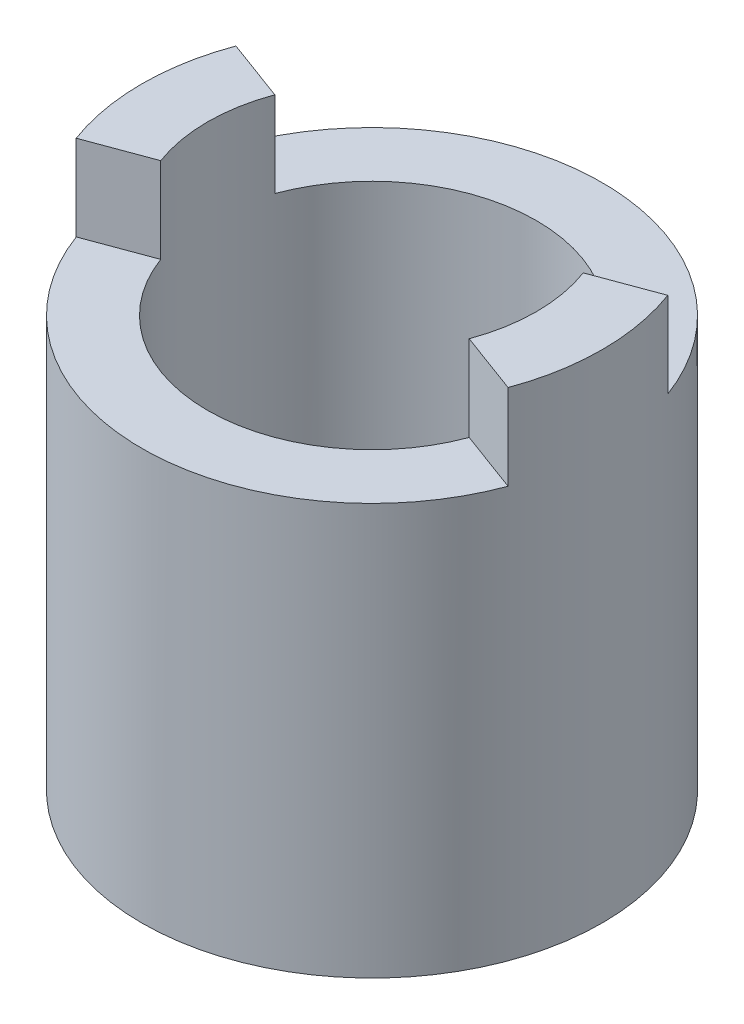
ISO-10303-21;
HEADER;
FILE_DESCRIPTION(('STEP AP214'),'2;1');
FILE_NAME('part.step','',(''),(''),'','','');
FILE_SCHEMA(('AUTOMOTIVE_DESIGN { 1 0 10303 214 1 1 1 1 }'));
ENDSEC;
DATA;
#1=APPLICATION_CONTEXT('core data for automotive mechanical design processes');
#2=APPLICATION_PROTOCOL_DEFINITION('international standard','automotive_design',2000,#1);
#3=PRODUCT_CONTEXT('',#1,'mechanical');
#4=PRODUCT('Part','Part','',(#3));
#5=PRODUCT_RELATED_PRODUCT_CATEGORY('part','',(#4));
#6=PRODUCT_DEFINITION_FORMATION('','',#4);
#7=PRODUCT_DEFINITION_CONTEXT('part definition',#1,'design');
#8=PRODUCT_DEFINITION('design','',#6,#7);
#9=PRODUCT_DEFINITION_SHAPE('','',#8);
#10=(LENGTH_UNIT() NAMED_UNIT(*) SI_UNIT(.MILLI.,.METRE.));
#11=(NAMED_UNIT(*) PLANE_ANGLE_UNIT() SI_UNIT($,.RADIAN.));
#12=(NAMED_UNIT(*) SI_UNIT($,.STERADIAN.) SOLID_ANGLE_UNIT());
#13=UNCERTAINTY_MEASURE_WITH_UNIT(LENGTH_MEASURE(1.E-05),#10,'distance_accuracy_value','');
#14=(GEOMETRIC_REPRESENTATION_CONTEXT(3) GLOBAL_UNCERTAINTY_ASSIGNED_CONTEXT((#13)) GLOBAL_UNIT_ASSIGNED_CONTEXT((#10,
#11,#12)) REPRESENTATION_CONTEXT('',''));
#15=CARTESIAN_POINT('',(0.,0.,0.));
#16=DIRECTION('',(0.,0.,1.));
#17=DIRECTION('',(1.,0.,0.));
#18=AXIS2_PLACEMENT_3D('',#15,#16,#17);
#19=CARTESIAN_POINT('',(0.,6.25,0.));
#20=DIRECTION('',(0.,1.,0.));
#21=DIRECTION('',(0.,0.,1.));
#22=AXIS2_PLACEMENT_3D('',#19,#20,#21);
#23=PLANE('',#22);
#24=CARTESIAN_POINT('',(0.,6.25,0.));
#25=DIRECTION('',(0.,1.,0.));
#26=DIRECTION('',(0.,0.,1.));
#27=AXIS2_PLACEMENT_3D('',#24,#25,#26);
#28=CIRCLE('',#27,2.5);
#29=CARTESIAN_POINT('',(-2.34475912302273,6.25,0.867239675638555));
#30=VERTEX_POINT('',#29);
#31=CARTESIAN_POINT('',(2.34475912302273,6.25,0.867239675638555));
#32=VERTEX_POINT('',#31);
#33=EDGE_CURVE('E61',#30,#32,#28,.T.);
#34=ORIENTED_EDGE('',*,*,#33,.F.);
#35=DIRECTION('',(0.937903649209093,0.,-0.346895870255422));
#36=VECTOR('',#35,1.);
#37=CARTESIAN_POINT('',(-2.34475912302273,6.25,0.867239675638555));
#38=LINE('',#37,#36);
#39=CARTESIAN_POINT('',(-3.28266277223183,6.25,1.21413554589398));
#40=VERTEX_POINT('',#39);
#41=EDGE_CURVE('E187',#40,#30,#38,.T.);
#42=ORIENTED_EDGE('',*,*,#41,.F.);
#43=CARTESIAN_POINT('',(0.,6.25,0.));
#44=DIRECTION('',(0.,1.,0.));
#45=DIRECTION('',(0.,0.,1.));
#46=AXIS2_PLACEMENT_3D('',#43,#44,#45);
#47=CIRCLE('',#46,3.5);
#48=CARTESIAN_POINT('',(3.28266277223183,6.25,1.21413554589398));
#49=VERTEX_POINT('',#48);
#50=EDGE_CURVE('E49',#40,#49,#47,.T.);
#51=ORIENTED_EDGE('',*,*,#50,.T.);
#52=DIRECTION('',(0.937903649209093,0.,0.346895870255422));
#53=VECTOR('',#52,1.);
#54=CARTESIAN_POINT('',(2.34475912302273,6.25,0.867239675638555));
#55=LINE('',#54,#53);
#56=EDGE_CURVE('E136',#32,#49,#55,.T.);
#57=ORIENTED_EDGE('',*,*,#56,.F.);
#58=EDGE_LOOP('',(#34,#42,#51,#57));
#59=FACE_BOUND('',#58,.T.);
#60=ADVANCED_FACE('F39',(#59),#23,.T.);
#61=CARTESIAN_POINT('',(3.28266277223183,6.25,-1.21413554589398));
#62=VERTEX_POINT('',#61);
#63=CARTESIAN_POINT('',(-3.28266277223183,6.25,-1.21413554589398));
#64=VERTEX_POINT('',#63);
#65=EDGE_CURVE('E11',#62,#64,#47,.T.);
#66=ORIENTED_EDGE('',*,*,#65,.T.);
#67=DIRECTION('',(-0.937903649209093,0.,-0.346895870255422));
#68=VECTOR('',#67,1.);
#69=CARTESIAN_POINT('',(-2.34475912302273,6.25,-0.867239675638555));
#70=LINE('',#69,#68);
#71=CARTESIAN_POINT('',(-2.34475912302273,6.25,-0.867239675638555));
#72=VERTEX_POINT('',#71);
#73=EDGE_CURVE('E124',#72,#64,#70,.T.);
#74=ORIENTED_EDGE('',*,*,#73,.F.);
#75=CARTESIAN_POINT('',(2.34475912302273,6.25,-0.867239675638555));
#76=VERTEX_POINT('',#75);
#77=EDGE_CURVE('E174',#76,#72,#28,.T.);
#78=ORIENTED_EDGE('',*,*,#77,.F.);
#79=DIRECTION('',(-0.937903649209093,0.,0.346895870255422));
#80=VECTOR('',#79,1.);
#81=CARTESIAN_POINT('',(2.34475912302273,6.25,-0.867239675638555));
#82=LINE('',#81,#80);
#83=EDGE_CURVE('E131',#62,#76,#82,.T.);
#84=ORIENTED_EDGE('',*,*,#83,.F.);
#85=EDGE_LOOP('',(#66,#74,#78,#84));
#86=FACE_BOUND('',#85,.T.);
#87=ADVANCED_FACE('F213',(#86),#23,.T.);
#88=CARTESIAN_POINT('',(0.,0.,0.));
#89=DIRECTION('',(0.,1.,0.));
#90=DIRECTION('',(0.,0.,1.));
#91=AXIS2_PLACEMENT_3D('',#88,#89,#90);
#92=PLANE('',#91);
#93=CARTESIAN_POINT('',(0.,0.,0.));
#94=DIRECTION('',(0.,1.,0.));
#95=DIRECTION('',(0.,0.,1.));
#96=AXIS2_PLACEMENT_3D('',#93,#94,#95);
#97=CIRCLE('',#96,3.5);
#98=CARTESIAN_POINT('',(0.,0.,3.5));
#99=VERTEX_POINT('',#98);
#100=EDGE_CURVE('E43',#99,#99,#97,.T.);
#101=ORIENTED_EDGE('',*,*,#100,.F.);
#102=EDGE_LOOP('',(#101));
#103=FACE_BOUND('',#102,.T.);
#104=CARTESIAN_POINT('',(0.,0.,0.));
#105=DIRECTION('',(0.,1.,0.));
#106=DIRECTION('',(0.,0.,1.));
#107=AXIS2_PLACEMENT_3D('',#104,#105,#106);
#108=CIRCLE('',#107,2.5);
#109=CARTESIAN_POINT('',(0.,0.,2.5));
#110=VERTEX_POINT('',#109);
#111=EDGE_CURVE('E173',#110,#110,#108,.T.);
#112=ORIENTED_EDGE('',*,*,#111,.T.);
#113=EDGE_LOOP('',(#112));
#114=FACE_BOUND('',#113,.T.);
#115=ADVANCED_FACE('F210',(#103,#114),#92,.F.);
#116=CARTESIAN_POINT('',(0.,6.25,0.));
#117=DIRECTION('',(0.,-1.,0.));
#118=DIRECTION('',(0.,0.,-1.));
#119=AXIS2_PLACEMENT_3D('',#116,#117,#118);
#120=CYLINDRICAL_SURFACE('',#119,3.5);
#121=ORIENTED_EDGE('',*,*,#65,.F.);
#122=DIRECTION('',(0.,-1.,0.));
#123=VECTOR('',#122,1.);
#124=CARTESIAN_POINT('',(3.28266277223183,7.55,-1.21413554589398));
#125=LINE('',#124,#123);
#126=CARTESIAN_POINT('',(3.28266277223183,7.55,-1.21413554589398));
#127=VERTEX_POINT('',#126);
#128=EDGE_CURVE('E169',#127,#62,#125,.T.);
#129=ORIENTED_EDGE('',*,*,#128,.F.);
#130=CARTESIAN_POINT('',(0.,7.55,0.));
#131=DIRECTION('',(0.,1.,0.));
#132=DIRECTION('',(0.,0.,1.));
#133=AXIS2_PLACEMENT_3D('',#130,#131,#132);
#134=CIRCLE('',#133,3.5);
#135=CARTESIAN_POINT('',(3.28266277223183,7.55,1.21413554589398));
#136=VERTEX_POINT('',#135);
#137=EDGE_CURVE('E142',#136,#127,#134,.T.);
#138=ORIENTED_EDGE('',*,*,#137,.F.);
#139=DIRECTION('',(0.,-1.,0.));
#140=VECTOR('',#139,1.);
#141=CARTESIAN_POINT('',(3.28266277223183,7.55,1.21413554589398));
#142=LINE('',#141,#140);
#143=EDGE_CURVE('E154',#136,#49,#142,.T.);
#144=ORIENTED_EDGE('',*,*,#143,.T.);
#145=ORIENTED_EDGE('',*,*,#50,.F.);
#146=DIRECTION('',(0.,-1.,0.));
#147=VECTOR('',#146,1.);
#148=CARTESIAN_POINT('',(-3.28266277223183,7.55,1.21413554589398));
#149=LINE('',#148,#147);
#150=CARTESIAN_POINT('',(-3.28266277223183,7.55,1.21413554589398));
#151=VERTEX_POINT('',#150);
#152=EDGE_CURVE('E109',#151,#40,#149,.T.);
#153=ORIENTED_EDGE('',*,*,#152,.F.);
#154=CARTESIAN_POINT('',(0.,7.55,0.));
#155=DIRECTION('',(0.,1.,0.));
#156=DIRECTION('',(0.,0.,1.));
#157=AXIS2_PLACEMENT_3D('',#154,#155,#156);
#158=CIRCLE('',#157,3.5);
#159=CARTESIAN_POINT('',(-3.28266277223183,7.55,-1.21413554589398));
#160=VERTEX_POINT('',#159);
#161=EDGE_CURVE('E114',#160,#151,#158,.T.);
#162=ORIENTED_EDGE('',*,*,#161,.F.);
#163=DIRECTION('',(0.,-1.,0.));
#164=VECTOR('',#163,1.);
#165=CARTESIAN_POINT('',(-3.28266277223183,7.55,-1.21413554589398));
#166=LINE('',#165,#164);
#167=EDGE_CURVE('E290',#160,#64,#166,.T.);
#168=ORIENTED_EDGE('',*,*,#167,.T.);
#169=EDGE_LOOP('',(#121,#129,#138,#144,#145,#153,#162,#168));
#170=FACE_BOUND('',#169,.T.);
#171=ORIENTED_EDGE('',*,*,#100,.T.);
#172=EDGE_LOOP('',(#171));
#173=FACE_BOUND('',#172,.T.);
#174=ADVANCED_FACE('F41',(#170,#173),#120,.T.);
#175=CARTESIAN_POINT('',(0.,6.25,0.));
#176=DIRECTION('',(0.,-1.,0.));
#177=DIRECTION('',(0.,0.,-1.));
#178=AXIS2_PLACEMENT_3D('',#175,#176,#177);
#179=CYLINDRICAL_SURFACE('',#178,2.5);
#180=ORIENTED_EDGE('',*,*,#77,.T.);
#181=DIRECTION('',(0.,-1.,0.));
#182=VECTOR('',#181,1.);
#183=CARTESIAN_POINT('',(-2.34475912302273,7.55,-0.867239675638555));
#184=LINE('',#183,#182);
#185=CARTESIAN_POINT('',(-2.34475912302273,7.55,-0.867239675638555));
#186=VERTEX_POINT('',#185);
#187=EDGE_CURVE('E138',#186,#72,#184,.T.);
#188=ORIENTED_EDGE('',*,*,#187,.F.);
#189=CARTESIAN_POINT('',(0.,7.55,0.));
#190=DIRECTION('',(0.,-1.,0.));
#191=DIRECTION('',(0.,0.,1.));
#192=AXIS2_PLACEMENT_3D('',#189,#190,#191);
#193=CIRCLE('',#192,2.5);
#194=CARTESIAN_POINT('',(-2.34475912302273,7.55,0.867239675638555));
#195=VERTEX_POINT('',#194);
#196=EDGE_CURVE('E113',#195,#186,#193,.T.);
#197=ORIENTED_EDGE('',*,*,#196,.F.);
#198=DIRECTION('',(0.,-1.,0.));
#199=VECTOR('',#198,1.);
#200=CARTESIAN_POINT('',(-2.34475912302273,7.55,0.867239675638555));
#201=LINE('',#200,#199);
#202=EDGE_CURVE('E56',#195,#30,#201,.T.);
#203=ORIENTED_EDGE('',*,*,#202,.T.);
#204=ORIENTED_EDGE('',*,*,#33,.T.);
#205=DIRECTION('',(0.,-1.,0.));
#206=VECTOR('',#205,1.);
#207=CARTESIAN_POINT('',(2.34475912302273,7.55,0.867239675638555));
#208=LINE('',#207,#206);
#209=CARTESIAN_POINT('',(2.34475912302273,7.55,0.867239675638555));
#210=VERTEX_POINT('',#209);
#211=EDGE_CURVE('E161',#210,#32,#208,.T.);
#212=ORIENTED_EDGE('',*,*,#211,.F.);
#213=CARTESIAN_POINT('',(0.,7.55,0.));
#214=DIRECTION('',(0.,-1.,0.));
#215=DIRECTION('',(0.,0.,1.));
#216=AXIS2_PLACEMENT_3D('',#213,#214,#215);
#217=CIRCLE('',#216,2.5);
#218=CARTESIAN_POINT('',(2.34475912302273,7.55,-0.867239675638555));
#219=VERTEX_POINT('',#218);
#220=EDGE_CURVE('E149',#219,#210,#217,.T.);
#221=ORIENTED_EDGE('',*,*,#220,.F.);
#222=DIRECTION('',(0.,-1.,0.));
#223=VECTOR('',#222,1.);
#224=CARTESIAN_POINT('',(2.34475912302273,7.55,-0.867239675638555));
#225=LINE('',#224,#223);
#226=EDGE_CURVE('E165',#219,#76,#225,.T.);
#227=ORIENTED_EDGE('',*,*,#226,.T.);
#228=EDGE_LOOP('',(#180,#188,#197,#203,#204,#212,#221,#227));
#229=FACE_BOUND('',#228,.T.);
#230=ORIENTED_EDGE('',*,*,#111,.F.);
#231=EDGE_LOOP('',(#230));
#232=FACE_BOUND('',#231,.T.);
#233=ADVANCED_FACE('F198',(#229,#232),#179,.F.);
#234=CARTESIAN_POINT('',(2.34475912302273,7.55,-0.867239675638555));
#235=DIRECTION('',(0.346895870255422,0.,0.937903649209093));
#236=DIRECTION('',(0.937903649209093,0.,-0.346895870255422));
#237=AXIS2_PLACEMENT_3D('',#234,#235,#236);
#238=PLANE('',#237);
#239=ORIENTED_EDGE('',*,*,#83,.T.);
#240=ORIENTED_EDGE('',*,*,#226,.F.);
#241=DIRECTION('',(-0.937903649209093,0.,0.346895870255422));
#242=VECTOR('',#241,1.);
#243=CARTESIAN_POINT('',(2.34475912302273,7.55,-0.867239675638555));
#244=LINE('',#243,#242);
#245=EDGE_CURVE('E146',#127,#219,#244,.T.);
#246=ORIENTED_EDGE('',*,*,#245,.F.);
#247=ORIENTED_EDGE('',*,*,#128,.T.);
#248=EDGE_LOOP('',(#239,#240,#246,#247));
#249=FACE_BOUND('',#248,.T.);
#250=ADVANCED_FACE('F202',(#249),#238,.F.);
#251=CARTESIAN_POINT('',(2.34475912302273,7.55,0.867239675638555));
#252=DIRECTION('',(0.346895870255422,0.,-0.937903649209093));
#253=DIRECTION('',(-0.937903649209093,0.,-0.346895870255422));
#254=AXIS2_PLACEMENT_3D('',#251,#252,#253);
#255=PLANE('',#254);
#256=ORIENTED_EDGE('',*,*,#56,.T.);
#257=ORIENTED_EDGE('',*,*,#143,.F.);
#258=DIRECTION('',(0.937903649209093,0.,0.346895870255422));
#259=VECTOR('',#258,1.);
#260=CARTESIAN_POINT('',(2.34475912302273,7.55,0.867239675638555));
#261=LINE('',#260,#259);
#262=EDGE_CURVE('E152',#210,#136,#261,.T.);
#263=ORIENTED_EDGE('',*,*,#262,.F.);
#264=ORIENTED_EDGE('',*,*,#211,.T.);
#265=EDGE_LOOP('',(#256,#257,#263,#264));
#266=FACE_BOUND('',#265,.T.);
#267=ADVANCED_FACE('F190',(#266),#255,.F.);
#268=CARTESIAN_POINT('',(0.,7.55,0.));
#269=DIRECTION('',(0.,1.,0.));
#270=DIRECTION('',(0.,0.,1.));
#271=AXIS2_PLACEMENT_3D('',#268,#269,#270);
#272=PLANE('',#271);
#273=ORIENTED_EDGE('',*,*,#137,.T.);
#274=ORIENTED_EDGE('',*,*,#245,.T.);
#275=ORIENTED_EDGE('',*,*,#220,.T.);
#276=ORIENTED_EDGE('',*,*,#262,.T.);
#277=EDGE_LOOP('',(#273,#274,#275,#276));
#278=FACE_BOUND('',#277,.T.);
#279=ADVANCED_FACE('F195',(#278),#272,.T.);
#280=CARTESIAN_POINT('',(-2.34475912302273,7.55,0.867239675638555));
#281=DIRECTION('',(-0.346895870255422,0.,-0.937903649209093));
#282=DIRECTION('',(-0.937903649209093,0.,0.346895870255422));
#283=AXIS2_PLACEMENT_3D('',#280,#281,#282);
#284=PLANE('',#283);
#285=ORIENTED_EDGE('',*,*,#41,.T.);
#286=ORIENTED_EDGE('',*,*,#202,.F.);
#287=DIRECTION('',(0.937903649209093,0.,-0.346895870255422));
#288=VECTOR('',#287,1.);
#289=CARTESIAN_POINT('',(-2.34475912302273,7.55,0.867239675638555));
#290=LINE('',#289,#288);
#291=EDGE_CURVE('E105',#151,#195,#290,.T.);
#292=ORIENTED_EDGE('',*,*,#291,.F.);
#293=ORIENTED_EDGE('',*,*,#152,.T.);
#294=EDGE_LOOP('',(#285,#286,#292,#293));
#295=FACE_BOUND('',#294,.T.);
#296=ADVANCED_FACE('F107',(#295),#284,.F.);
#297=CARTESIAN_POINT('',(-2.34475912302273,7.55,-0.867239675638555));
#298=DIRECTION('',(-0.346895870255422,0.,0.937903649209093));
#299=DIRECTION('',(0.937903649209093,0.,0.346895870255422));
#300=AXIS2_PLACEMENT_3D('',#297,#298,#299);
#301=PLANE('',#300);
#302=ORIENTED_EDGE('',*,*,#73,.T.);
#303=ORIENTED_EDGE('',*,*,#167,.F.);
#304=DIRECTION('',(-0.937903649209093,0.,-0.346895870255422));
#305=VECTOR('',#304,1.);
#306=CARTESIAN_POINT('',(-2.34475912302273,7.55,-0.867239675638555));
#307=LINE('',#306,#305);
#308=EDGE_CURVE('E119',#186,#160,#307,.T.);
#309=ORIENTED_EDGE('',*,*,#308,.F.);
#310=ORIENTED_EDGE('',*,*,#187,.T.);
#311=EDGE_LOOP('',(#302,#303,#309,#310));
#312=FACE_BOUND('',#311,.T.);
#313=ADVANCED_FACE('F268',(#312),#301,.F.);
#314=CARTESIAN_POINT('',(0.,7.55,0.));
#315=DIRECTION('',(0.,1.,0.));
#316=DIRECTION('',(0.,0.,1.));
#317=AXIS2_PLACEMENT_3D('',#314,#315,#316);
#318=PLANE('',#317);
#319=ORIENTED_EDGE('',*,*,#161,.T.);
#320=ORIENTED_EDGE('',*,*,#291,.T.);
#321=ORIENTED_EDGE('',*,*,#196,.T.);
#322=ORIENTED_EDGE('',*,*,#308,.T.);
#323=EDGE_LOOP('',(#319,#320,#321,#322));
#324=FACE_BOUND('',#323,.T.);
#325=ADVANCED_FACE('F117',(#324),#318,.T.);
#326=CLOSED_SHELL('',(#60,#87,#115,#174,#233,#250,#267,#279,#296,#313,#325));
#327=MANIFOLD_SOLID_BREP('B2',#326);
#328=ADVANCED_BREP_SHAPE_REPRESENTATION('',(#18,#327),#14);
#329=SHAPE_DEFINITION_REPRESENTATION(#9,#328);
ENDSEC;
END-ISO-10303-21;
